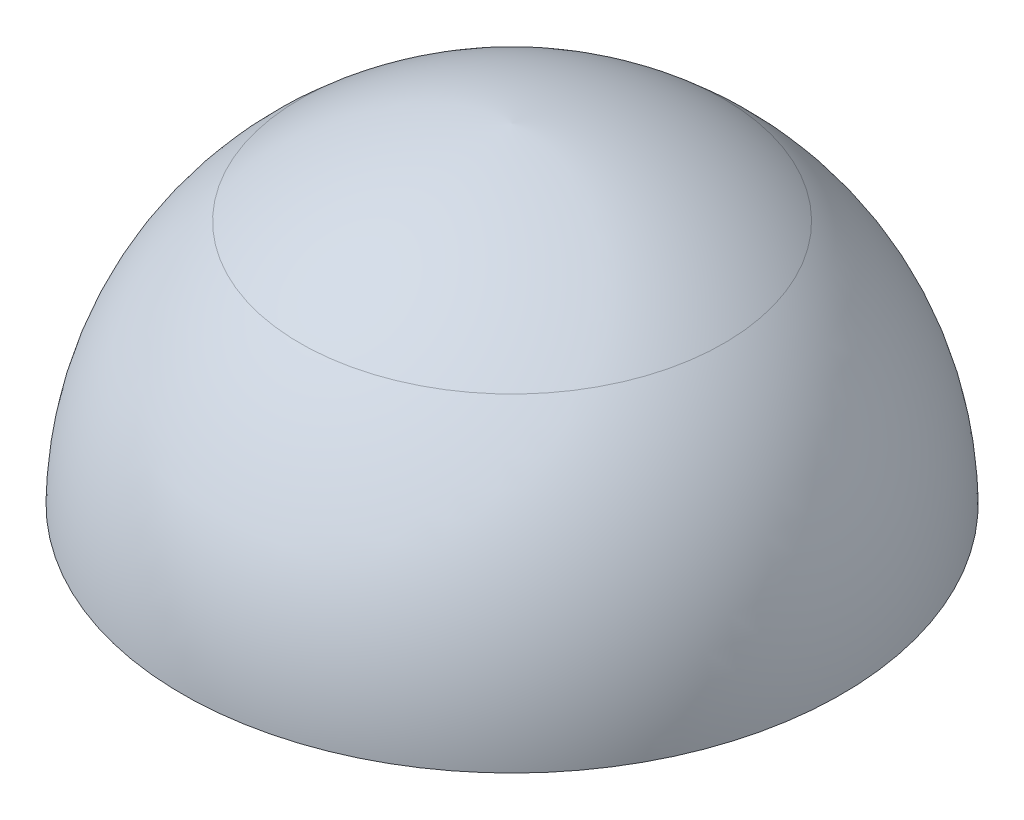
ISO-10303-21;
HEADER;
FILE_DESCRIPTION(('STEP AP214'),'2;1');
FILE_NAME('part.step','',(''),(''),'','','');
FILE_SCHEMA(('AUTOMOTIVE_DESIGN { 1 0 10303 214 1 1 1 1 }'));
ENDSEC;
DATA;
#1=APPLICATION_CONTEXT('core data for automotive mechanical design processes');
#2=APPLICATION_PROTOCOL_DEFINITION('international standard','automotive_design',2000,#1);
#3=PRODUCT_CONTEXT('',#1,'mechanical');
#4=PRODUCT('Part','Part','',(#3));
#5=PRODUCT_RELATED_PRODUCT_CATEGORY('part','',(#4));
#6=PRODUCT_DEFINITION_FORMATION('','',#4);
#7=PRODUCT_DEFINITION_CONTEXT('part definition',#1,'design');
#8=PRODUCT_DEFINITION('design','',#6,#7);
#9=PRODUCT_DEFINITION_SHAPE('','',#8);
#10=(LENGTH_UNIT() NAMED_UNIT(*) SI_UNIT(.MILLI.,.METRE.));
#11=(NAMED_UNIT(*) PLANE_ANGLE_UNIT() SI_UNIT($,.RADIAN.));
#12=(NAMED_UNIT(*) SI_UNIT($,.STERADIAN.) SOLID_ANGLE_UNIT());
#13=UNCERTAINTY_MEASURE_WITH_UNIT(LENGTH_MEASURE(1.E-05),#10,'distance_accuracy_value','');
#14=(GEOMETRIC_REPRESENTATION_CONTEXT(3) GLOBAL_UNCERTAINTY_ASSIGNED_CONTEXT((#13)) GLOBAL_UNIT_ASSIGNED_CONTEXT((#10,
#11,#12)) REPRESENTATION_CONTEXT('',''));
#15=CARTESIAN_POINT('',(0.,0.,0.));
#16=DIRECTION('',(0.,0.,1.));
#17=DIRECTION('',(1.,0.,0.));
#18=AXIS2_PLACEMENT_3D('',#15,#16,#17);
#19=CARTESIAN_POINT('',(0.,0.,0.));
#20=DIRECTION('',(0.,1.,0.));
#21=DIRECTION('',(0.,0.,1.));
#22=AXIS2_PLACEMENT_3D('',#19,#20,#21);
#23=PLANE('',#22);
#24=CARTESIAN_POINT('',(0.,0.,0.));
#25=DIRECTION('',(0.,1.,0.));
#26=DIRECTION('',(0.,0.,1.));
#27=AXIS2_PLACEMENT_3D('',#24,#25,#26);
#28=CIRCLE('',#27,1.99947663216981);
#29=CARTESIAN_POINT('',(0.,0.,1.99947663216981));
#30=VERTEX_POINT('',#29);
#31=EDGE_CURVE('E80',#30,#30,#28,.F.);
#32=ORIENTED_EDGE('',*,*,#31,.F.);
#33=EDGE_LOOP('',(#32));
#34=FACE_BOUND('',#33,.T.);
#35=CARTESIAN_POINT('',(0.,0.,0.));
#36=DIRECTION('',(0.,-1.,0.));
#37=DIRECTION('',(0.,0.,-1.));
#38=AXIS2_PLACEMENT_3D('',#35,#36,#37);
#39=CIRCLE('',#38,4.);
#40=CARTESIAN_POINT('',(0.,0.,-4.));
#41=VERTEX_POINT('',#40);
#42=EDGE_CURVE('E11',#41,#41,#39,.T.);
#43=ORIENTED_EDGE('',*,*,#42,.T.);
#44=EDGE_LOOP('',(#43));
#45=FACE_BOUND('',#44,.T.);
#46=ADVANCED_FACE('F43',(#34,#45),#23,.F.);
#47=CARTESIAN_POINT('',(0.,-0.0631855504718486,0.));
#48=DIRECTION('',(0.,-1.,0.));
#49=DIRECTION('',(0.,0.,-1.));
#50=AXIS2_PLACEMENT_3D('',#47,#48,#49);
#51=DEGENERATE_TOROIDAL_SURFACE('',#50,0.0625091211453117,3.93799782057485,.T.);
#52=ORIENTED_EDGE('',*,*,#42,.F.);
#53=EDGE_LOOP('',(#52));
#54=FACE_BOUND('',#53,.T.);
#55=CARTESIAN_POINT('',(0.,2.97298349152339,0.));
#56=DIRECTION('',(0.,-1.,0.));
#57=DIRECTION('',(0.,0.,-1.));
#58=AXIS2_PLACEMENT_3D('',#55,#56,#57);
#59=CIRCLE('',#58,2.57039755233239);
#60=CARTESIAN_POINT('',(0.,2.97298349152339,-2.57039755233239));
#61=VERTEX_POINT('',#60);
#62=EDGE_CURVE('E51',#61,#61,#59,.T.);
#63=ORIENTED_EDGE('',*,*,#62,.T.);
#64=EDGE_LOOP('',(#63));
#65=FACE_BOUND('',#64,.T.);
#66=ADVANCED_FACE('F71',(#54,#65),#51,.T.);
#67=CARTESIAN_POINT('',(0.,-0.521865503990195,0.316362454559228));
#68=DIRECTION('',(-1.,0.,0.));
#69=DIRECTION('',(0.,0.,-1.));
#70=AXIS2_PLACEMENT_3D('',#67,#68,#69);
#71=CIRCLE('',#70,4.53291879905555);
#72=TRIMMED_CURVE('',#71,(PARAMETER_VALUE(-1.50094732567029)),
(PARAMETER_VALUE(1.50094732567029)),.T.,.PARAMETER.);
#73=CARTESIAN_POINT('',(0.,-0.521865503990195,0.));
#74=DIRECTION('',(0.,-1.,0.));
#75=AXIS1_PLACEMENT('',#73,#74);
#76=SURFACE_OF_REVOLUTION('',#72,#75);
#77=ORIENTED_EDGE('',*,*,#62,.F.);
#78=EDGE_LOOP('',(#77));
#79=FACE_BOUND('',#78,.T.);
#80=CARTESIAN_POINT('',(0.,4.,0.));
#81=VERTEX_POINT('',#80);
#82=VERTEX_LOOP('',#81);
#83=FACE_BOUND('',#82,.T.);
#84=ADVANCED_FACE('F65',(#79,#83),#76,.T.);
#85=CARTESIAN_POINT('',(0.,-0.0631855504718486,0.));
#86=DIRECTION('',(0.,-1.,0.));
#87=DIRECTION('',(0.,0.,-1.));
#88=AXIS2_PLACEMENT_3D('',#85,#86,#87);
#89=DEGENERATE_TOROIDAL_SURFACE('',#88,0.0625091211453117,1.93799782057485,.T.);
#90=ORIENTED_EDGE('',*,*,#31,.T.);
#91=EDGE_LOOP('',(#90));
#92=FACE_BOUND('',#91,.T.);
#93=CARTESIAN_POINT('',(0.,1.43099734509529,0.));
#94=DIRECTION('',(0.,-1.,0.));
#95=DIRECTION('',(0.,0.,-1.));
#96=AXIS2_PLACEMENT_3D('',#93,#94,#95);
#97=CIRCLE('',#96,1.2967104933482);
#98=CARTESIAN_POINT('',(0.,1.43099734509529,-1.2967104933482));
#99=VERTEX_POINT('',#98);
#100=EDGE_CURVE('E88',#99,#99,#97,.T.);
#101=ORIENTED_EDGE('',*,*,#100,.F.);
#102=EDGE_LOOP('',(#101));
#103=FACE_BOUND('',#102,.T.);
#104=ADVANCED_FACE('F59',(#92,#103),#89,.F.);
#105=CARTESIAN_POINT('',(0.,-0.521865503990195,0.316362454559228));
#106=DIRECTION('',(-1.,0.,0.));
#107=DIRECTION('',(0.,0.,-1.));
#108=AXIS2_PLACEMENT_3D('',#105,#106,#107);
#109=CIRCLE('',#108,2.53291879905555);
#110=TRIMMED_CURVE('',#109,(PARAMETER_VALUE(-1.44556892875749)),
(PARAMETER_VALUE(1.44556892875749)),.T.,.PARAMETER.);
#111=CARTESIAN_POINT('',(0.,-0.521865503990195,0.));
#112=DIRECTION('',(0.,-1.,0.));
#113=AXIS1_PLACEMENT('',#111,#112);
#114=SURFACE_OF_REVOLUTION('',#110,#113);
#115=ORIENTED_EDGE('',*,*,#100,.T.);
#116=EDGE_LOOP('',(#115));
#117=FACE_BOUND('',#116,.T.);
#118=CARTESIAN_POINT('',(0.,1.99121874448901,0.));
#119=VERTEX_POINT('',#118);
#120=VERTEX_LOOP('',#119);
#121=FACE_BOUND('',#120,.T.);
#122=ADVANCED_FACE('F57',(#117,#121),#114,.F.);
#123=CLOSED_SHELL('',(#46,#66,#84,#104,#122));
#124=MANIFOLD_SOLID_BREP('B2',#123);
#125=ADVANCED_BREP_SHAPE_REPRESENTATION('',(#18,#124),#14);
#126=SHAPE_DEFINITION_REPRESENTATION(#9,#125);
ENDSEC;
END-ISO-10303-21;
